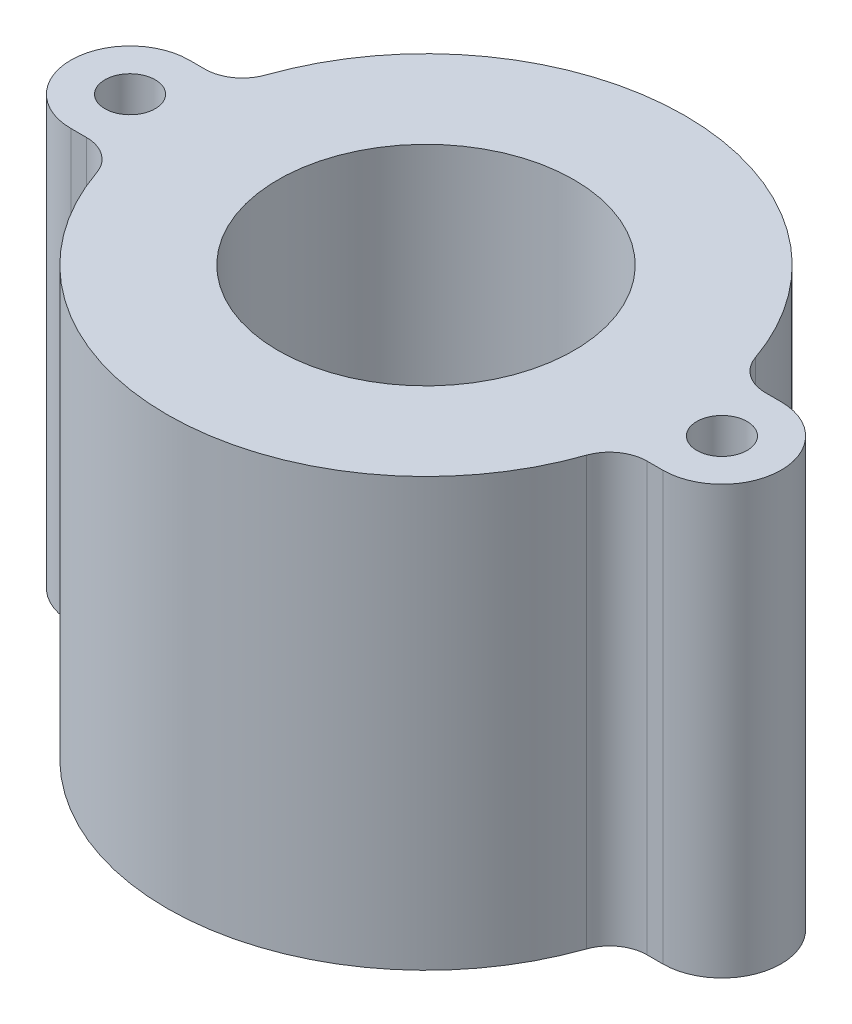
ISO-10303-21;
HEADER;
FILE_DESCRIPTION(('STEP AP214'),'2;1');
FILE_NAME('part.step','',(''),(''),'','','');
FILE_SCHEMA(('AUTOMOTIVE_DESIGN { 1 0 10303 214 1 1 1 1 }'));
ENDSEC;
DATA;
#1=APPLICATION_CONTEXT('core data for automotive mechanical design processes');
#2=APPLICATION_PROTOCOL_DEFINITION('international standard','automotive_design',2000,#1);
#3=PRODUCT_CONTEXT('',#1,'mechanical');
#4=PRODUCT('Part','Part','',(#3));
#5=PRODUCT_RELATED_PRODUCT_CATEGORY('part','',(#4));
#6=PRODUCT_DEFINITION_FORMATION('','',#4);
#7=PRODUCT_DEFINITION_CONTEXT('part definition',#1,'design');
#8=PRODUCT_DEFINITION('design','',#6,#7);
#9=PRODUCT_DEFINITION_SHAPE('','',#8);
#10=(LENGTH_UNIT() NAMED_UNIT(*) SI_UNIT(.MILLI.,.METRE.));
#11=(NAMED_UNIT(*) PLANE_ANGLE_UNIT() SI_UNIT($,.RADIAN.));
#12=(NAMED_UNIT(*) SI_UNIT($,.STERADIAN.) SOLID_ANGLE_UNIT());
#13=UNCERTAINTY_MEASURE_WITH_UNIT(LENGTH_MEASURE(1.E-05),#10,'distance_accuracy_value','');
#14=(GEOMETRIC_REPRESENTATION_CONTEXT(3) GLOBAL_UNCERTAINTY_ASSIGNED_CONTEXT((#13)) GLOBAL_UNIT_ASSIGNED_CONTEXT((#10,
#11,#12)) REPRESENTATION_CONTEXT('',''));
#15=CARTESIAN_POINT('',(0.,0.,0.));
#16=DIRECTION('',(0.,0.,1.));
#17=DIRECTION('',(1.,0.,0.));
#18=AXIS2_PLACEMENT_3D('',#15,#16,#17);
#19=CARTESIAN_POINT('',(0.,28.9,0.));
#20=DIRECTION('',(0.,-1.,0.));
#21=DIRECTION('',(0.,0.,-1.));
#22=AXIS2_PLACEMENT_3D('',#19,#20,#21);
#23=CYLINDRICAL_SURFACE('',#22,17.5);
#24=CARTESIAN_POINT('',(0.,0.,0.));
#25=DIRECTION('',(0.,1.,0.));
#26=DIRECTION('',(0.,0.,1.));
#27=AXIS2_PLACEMENT_3D('',#24,#25,#26);
#28=CIRCLE('',#27,17.5);
#29=CARTESIAN_POINT('',(-16.5418738314683,0.,5.71107784431138));
#30=VERTEX_POINT('',#29);
#31=CARTESIAN_POINT('',(16.5418738314683,0.,5.71107784431138));
#32=VERTEX_POINT('',#31);
#33=EDGE_CURVE('E184',#30,#32,#28,.T.);
#34=ORIENTED_EDGE('',*,*,#33,.T.);
#35=DIRECTION('',(0.,-1.,0.));
#36=VECTOR('',#35,1.);
#37=CARTESIAN_POINT('',(16.5418738314683,28.9,5.71107784431138));
#38=LINE('',#37,#36);
#39=CARTESIAN_POINT('',(16.5418738314683,28.9,5.71107784431138));
#40=VERTEX_POINT('',#39);
#41=EDGE_CURVE('E242',#32,#40,#38,.F.);
#42=ORIENTED_EDGE('',*,*,#41,.T.);
#43=CARTESIAN_POINT('',(0.,28.9,0.));
#44=DIRECTION('',(0.,1.,0.));
#45=DIRECTION('',(0.,0.,1.));
#46=AXIS2_PLACEMENT_3D('',#43,#44,#45);
#47=CIRCLE('',#46,17.5);
#48=CARTESIAN_POINT('',(-16.5418738314683,28.9,5.71107784431138));
#49=VERTEX_POINT('',#48);
#50=EDGE_CURVE('E154',#49,#40,#47,.T.);
#51=ORIENTED_EDGE('',*,*,#50,.F.);
#52=DIRECTION('',(0.,-1.,0.));
#53=VECTOR('',#52,1.);
#54=CARTESIAN_POINT('',(-16.5418738314683,28.9,5.71107784431138));
#55=LINE('',#54,#53);
#56=EDGE_CURVE('E238',#49,#30,#55,.T.);
#57=ORIENTED_EDGE('',*,*,#56,.T.);
#58=EDGE_LOOP('',(#34,#42,#51,#57));
#59=FACE_BOUND('',#58,.T.);
#60=ADVANCED_FACE('F41',(#59),#23,.T.);
#61=CARTESIAN_POINT('',(0.,28.9,4.));
#62=DIRECTION('',(0.,0.,1.));
#63=DIRECTION('',(1.,0.,0.));
#64=AXIS2_PLACEMENT_3D('',#61,#62,#63);
#65=PLANE('',#64);
#66=DIRECTION('',(-1.,0.,0.));
#67=VECTOR('',#66,1.);
#68=CARTESIAN_POINT('',(0.,28.9,4.));
#69=LINE('',#68,#67);
#70=CARTESIAN_POINT('',(20.,28.9,4.));
#71=VERTEX_POINT('',#70);
#72=CARTESIAN_POINT('',(18.9428086618643,28.9,4.));
#73=VERTEX_POINT('',#72);
#74=EDGE_CURVE('E133',#71,#73,#69,.T.);
#75=ORIENTED_EDGE('',*,*,#74,.T.);
#76=DIRECTION('',(0.,-1.,0.));
#77=VECTOR('',#76,1.);
#78=CARTESIAN_POINT('',(18.9428086618643,28.9,4.));
#79=LINE('',#78,#77);
#80=CARTESIAN_POINT('',(18.9428086618643,0.,4.));
#81=VERTEX_POINT('',#80);
#82=EDGE_CURVE('E235',#73,#81,#79,.T.);
#83=ORIENTED_EDGE('',*,*,#82,.T.);
#84=DIRECTION('',(-1.,0.,0.));
#85=VECTOR('',#84,1.);
#86=CARTESIAN_POINT('',(0.,0.,4.));
#87=LINE('',#86,#85);
#88=CARTESIAN_POINT('',(20.,0.,4.));
#89=VERTEX_POINT('',#88);
#90=EDGE_CURVE('E136',#89,#81,#87,.T.);
#91=ORIENTED_EDGE('',*,*,#90,.F.);
#92=DIRECTION('',(0.,-1.,0.));
#93=VECTOR('',#92,1.);
#94=CARTESIAN_POINT('',(20.,28.9,4.));
#95=LINE('',#94,#93);
#96=EDGE_CURVE('E129',#71,#89,#95,.T.);
#97=ORIENTED_EDGE('',*,*,#96,.F.);
#98=EDGE_LOOP('',(#75,#83,#91,#97));
#99=FACE_BOUND('',#98,.T.);
#100=ADVANCED_FACE('F131',(#99),#65,.T.);
#101=CARTESIAN_POINT('',(20.,28.9,0.));
#102=DIRECTION('',(0.,-1.,0.));
#103=DIRECTION('',(0.,0.,-1.));
#104=AXIS2_PLACEMENT_3D('',#101,#102,#103);
#105=CYLINDRICAL_SURFACE('',#104,4.);
#106=CARTESIAN_POINT('',(20.,0.,0.));
#107=DIRECTION('',(0.,1.,0.));
#108=DIRECTION('',(0.,0.,1.));
#109=AXIS2_PLACEMENT_3D('',#106,#107,#108);
#110=CIRCLE('',#109,4.);
#111=CARTESIAN_POINT('',(20.,0.,-4.));
#112=VERTEX_POINT('',#111);
#113=EDGE_CURVE('E191',#112,#89,#110,.F.);
#114=ORIENTED_EDGE('',*,*,#113,.F.);
#115=DIRECTION('',(0.,-1.,0.));
#116=VECTOR('',#115,1.);
#117=CARTESIAN_POINT('',(20.,28.9,-4.));
#118=LINE('',#117,#116);
#119=CARTESIAN_POINT('',(20.,28.9,-4.));
#120=VERTEX_POINT('',#119);
#121=EDGE_CURVE('E143',#120,#112,#118,.T.);
#122=ORIENTED_EDGE('',*,*,#121,.F.);
#123=CARTESIAN_POINT('',(20.,28.9,0.));
#124=DIRECTION('',(0.,1.,0.));
#125=DIRECTION('',(0.,0.,1.));
#126=AXIS2_PLACEMENT_3D('',#123,#124,#125);
#127=CIRCLE('',#126,4.);
#128=EDGE_CURVE('E149',#120,#71,#127,.F.);
#129=ORIENTED_EDGE('',*,*,#128,.T.);
#130=ORIENTED_EDGE('',*,*,#96,.T.);
#131=EDGE_LOOP('',(#114,#122,#129,#130));
#132=FACE_BOUND('',#131,.T.);
#133=ADVANCED_FACE('F156',(#132),#105,.T.);
#134=CARTESIAN_POINT('',(0.,28.9,-4.));
#135=DIRECTION('',(0.,0.,1.));
#136=DIRECTION('',(1.,0.,0.));
#137=AXIS2_PLACEMENT_3D('',#134,#135,#136);
#138=PLANE('',#137);
#139=DIRECTION('',(-1.,0.,0.));
#140=VECTOR('',#139,1.);
#141=CARTESIAN_POINT('',(0.,0.,-4.));
#142=LINE('',#141,#140);
#143=CARTESIAN_POINT('',(18.9428086618643,0.,-4.));
#144=VERTEX_POINT('',#143);
#145=EDGE_CURVE('E194',#112,#144,#142,.T.);
#146=ORIENTED_EDGE('',*,*,#145,.T.);
#147=DIRECTION('',(0.,1.,0.));
#148=VECTOR('',#147,1.);
#149=CARTESIAN_POINT('',(18.9428086618643,28.9,-4.));
#150=LINE('',#149,#148);
#151=CARTESIAN_POINT('',(18.9428086618643,28.9,-4.));
#152=VERTEX_POINT('',#151);
#153=EDGE_CURVE('E232',#144,#152,#150,.T.);
#154=ORIENTED_EDGE('',*,*,#153,.T.);
#155=DIRECTION('',(-1.,0.,0.));
#156=VECTOR('',#155,1.);
#157=CARTESIAN_POINT('',(0.,28.9,-4.));
#158=LINE('',#157,#156);
#159=EDGE_CURVE('E159',#120,#152,#158,.T.);
#160=ORIENTED_EDGE('',*,*,#159,.F.);
#161=ORIENTED_EDGE('',*,*,#121,.T.);
#162=EDGE_LOOP('',(#146,#154,#160,#161));
#163=FACE_BOUND('',#162,.T.);
#164=ADVANCED_FACE('F325',(#163),#138,.F.);
#165=CARTESIAN_POINT('',(0.,28.9,0.));
#166=DIRECTION('',(0.,-1.,0.));
#167=DIRECTION('',(0.,0.,-1.));
#168=AXIS2_PLACEMENT_3D('',#165,#166,#167);
#169=CYLINDRICAL_SURFACE('',#168,17.5);
#170=CARTESIAN_POINT('',(0.,0.,0.));
#171=DIRECTION('',(0.,1.,0.));
#172=DIRECTION('',(0.,0.,1.));
#173=AXIS2_PLACEMENT_3D('',#170,#171,#172);
#174=CIRCLE('',#173,17.5);
#175=CARTESIAN_POINT('',(16.5418738314683,0.,-5.71107784431138));
#176=VERTEX_POINT('',#175);
#177=CARTESIAN_POINT('',(-16.5418738314683,0.,-5.71107784431137));
#178=VERTEX_POINT('',#177);
#179=EDGE_CURVE('E198',#176,#178,#174,.T.);
#180=ORIENTED_EDGE('',*,*,#179,.T.);
#181=DIRECTION('',(0.,-1.,0.));
#182=VECTOR('',#181,1.);
#183=CARTESIAN_POINT('',(-16.5418738314683,28.9,-5.71107784431137));
#184=LINE('',#183,#182);
#185=CARTESIAN_POINT('',(-16.5418738314683,28.9,-5.71107784431137));
#186=VERTEX_POINT('',#185);
#187=EDGE_CURVE('E229',#178,#186,#184,.F.);
#188=ORIENTED_EDGE('',*,*,#187,.T.);
#189=CARTESIAN_POINT('',(0.,28.9,0.));
#190=DIRECTION('',(0.,1.,0.));
#191=DIRECTION('',(0.,0.,1.));
#192=AXIS2_PLACEMENT_3D('',#189,#190,#191);
#193=CIRCLE('',#192,17.5);
#194=CARTESIAN_POINT('',(16.5418738314683,28.9,-5.71107784431138));
#195=VERTEX_POINT('',#194);
#196=EDGE_CURVE('E162',#195,#186,#193,.T.);
#197=ORIENTED_EDGE('',*,*,#196,.F.);
#198=DIRECTION('',(0.,-1.,0.));
#199=VECTOR('',#198,1.);
#200=CARTESIAN_POINT('',(16.5418738314683,28.9,-5.71107784431138));
#201=LINE('',#200,#199);
#202=EDGE_CURVE('E225',#195,#176,#201,.T.);
#203=ORIENTED_EDGE('',*,*,#202,.T.);
#204=EDGE_LOOP('',(#180,#188,#197,#203));
#205=FACE_BOUND('',#204,.T.);
#206=ADVANCED_FACE('F319',(#205),#169,.T.);
#207=CARTESIAN_POINT('',(0.,28.9,-4.));
#208=DIRECTION('',(0.,0.,1.));
#209=DIRECTION('',(1.,0.,0.));
#210=AXIS2_PLACEMENT_3D('',#207,#208,#209);
#211=PLANE('',#210);
#212=DIRECTION('',(-1.,0.,0.));
#213=VECTOR('',#212,1.);
#214=CARTESIAN_POINT('',(0.,28.9,-4.));
#215=LINE('',#214,#213);
#216=CARTESIAN_POINT('',(-18.9428086618643,28.9,-4.));
#217=VERTEX_POINT('',#216);
#218=CARTESIAN_POINT('',(-20.,28.9,-4.));
#219=VERTEX_POINT('',#218);
#220=EDGE_CURVE('E169',#217,#219,#215,.T.);
#221=ORIENTED_EDGE('',*,*,#220,.F.);
#222=DIRECTION('',(0.,1.,0.));
#223=VECTOR('',#222,1.);
#224=CARTESIAN_POINT('',(-18.9428086618643,0.,-4.));
#225=LINE('',#224,#223);
#226=CARTESIAN_POINT('',(-18.9428086618643,0.,-4.));
#227=VERTEX_POINT('',#226);
#228=EDGE_CURVE('E142',#217,#227,#225,.F.);
#229=ORIENTED_EDGE('',*,*,#228,.T.);
#230=DIRECTION('',(-1.,0.,0.));
#231=VECTOR('',#230,1.);
#232=CARTESIAN_POINT('',(0.,0.,-4.));
#233=LINE('',#232,#231);
#234=CARTESIAN_POINT('',(-20.,0.,-4.));
#235=VERTEX_POINT('',#234);
#236=EDGE_CURVE('E202',#227,#235,#233,.T.);
#237=ORIENTED_EDGE('',*,*,#236,.T.);
#238=DIRECTION('',(0.,-1.,0.));
#239=VECTOR('',#238,1.);
#240=CARTESIAN_POINT('',(-20.,28.9,-4.));
#241=LINE('',#240,#239);
#242=EDGE_CURVE('E216',#219,#235,#241,.T.);
#243=ORIENTED_EDGE('',*,*,#242,.F.);
#244=EDGE_LOOP('',(#221,#229,#237,#243));
#245=FACE_BOUND('',#244,.T.);
#246=ADVANCED_FACE('F310',(#245),#211,.F.);
#247=CARTESIAN_POINT('',(-20.,28.9,0.));
#248=DIRECTION('',(0.,-1.,0.));
#249=DIRECTION('',(0.,0.,-1.));
#250=AXIS2_PLACEMENT_3D('',#247,#248,#249);
#251=CYLINDRICAL_SURFACE('',#250,4.);
#252=CARTESIAN_POINT('',(-20.,0.,0.));
#253=DIRECTION('',(0.,1.,0.));
#254=DIRECTION('',(0.,0.,1.));
#255=AXIS2_PLACEMENT_3D('',#252,#253,#254);
#256=CIRCLE('',#255,4.);
#257=CARTESIAN_POINT('',(-20.,0.,4.));
#258=VERTEX_POINT('',#257);
#259=EDGE_CURVE('E205',#235,#258,#256,.T.);
#260=ORIENTED_EDGE('',*,*,#259,.T.);
#261=DIRECTION('',(0.,-1.,0.));
#262=VECTOR('',#261,1.);
#263=CARTESIAN_POINT('',(-20.,28.9,4.));
#264=LINE('',#263,#262);
#265=CARTESIAN_POINT('',(-20.,28.9,4.));
#266=VERTEX_POINT('',#265);
#267=EDGE_CURVE('E179',#266,#258,#264,.T.);
#268=ORIENTED_EDGE('',*,*,#267,.F.);
#269=CARTESIAN_POINT('',(-20.,28.9,0.));
#270=DIRECTION('',(0.,1.,0.));
#271=DIRECTION('',(0.,0.,1.));
#272=AXIS2_PLACEMENT_3D('',#269,#270,#271);
#273=CIRCLE('',#272,4.);
#274=EDGE_CURVE('E172',#219,#266,#273,.T.);
#275=ORIENTED_EDGE('',*,*,#274,.F.);
#276=ORIENTED_EDGE('',*,*,#242,.T.);
#277=EDGE_LOOP('',(#260,#268,#275,#276));
#278=FACE_BOUND('',#277,.T.);
#279=ADVANCED_FACE('F294',(#278),#251,.T.);
#280=CARTESIAN_POINT('',(0.,28.9,0.));
#281=DIRECTION('',(0.,-1.,0.));
#282=DIRECTION('',(0.,0.,-1.));
#283=AXIS2_PLACEMENT_3D('',#280,#281,#282);
#284=CYLINDRICAL_SURFACE('',#283,10.);
#285=CARTESIAN_POINT('',(0.,28.9,0.));
#286=DIRECTION('',(0.,1.,0.));
#287=DIRECTION('',(0.,0.,1.));
#288=AXIS2_PLACEMENT_3D('',#285,#286,#287);
#289=CIRCLE('',#288,10.);
#290=CARTESIAN_POINT('',(0.,28.9,10.));
#291=VERTEX_POINT('',#290);
#292=EDGE_CURVE('E212',#291,#291,#289,.T.);
#293=ORIENTED_EDGE('',*,*,#292,.T.);
#294=EDGE_LOOP('',(#293));
#295=FACE_BOUND('',#294,.T.);
#296=CARTESIAN_POINT('',(0.,0.,0.));
#297=DIRECTION('',(0.,1.,0.));
#298=DIRECTION('',(0.,0.,1.));
#299=AXIS2_PLACEMENT_3D('',#296,#297,#298);
#300=CIRCLE('',#299,10.);
#301=CARTESIAN_POINT('',(0.,0.,10.));
#302=VERTEX_POINT('',#301);
#303=EDGE_CURVE('E180',#302,#302,#300,.T.);
#304=ORIENTED_EDGE('',*,*,#303,.F.);
#305=EDGE_LOOP('',(#304));
#306=FACE_BOUND('',#305,.T.);
#307=ADVANCED_FACE('F290',(#295,#306),#284,.F.);
#308=CARTESIAN_POINT('',(0.,28.9,4.));
#309=DIRECTION('',(0.,0.,1.));
#310=DIRECTION('',(1.,0.,0.));
#311=AXIS2_PLACEMENT_3D('',#308,#309,#310);
#312=PLANE('',#311);
#313=DIRECTION('',(-1.,0.,0.));
#314=VECTOR('',#313,1.);
#315=CARTESIAN_POINT('',(0.,0.,4.));
#316=LINE('',#315,#314);
#317=CARTESIAN_POINT('',(-18.9428086618643,0.,4.));
#318=VERTEX_POINT('',#317);
#319=EDGE_CURVE('E209',#318,#258,#316,.T.);
#320=ORIENTED_EDGE('',*,*,#319,.F.);
#321=DIRECTION('',(0.,-1.,0.));
#322=VECTOR('',#321,1.);
#323=CARTESIAN_POINT('',(-18.9428086618643,28.9,4.));
#324=LINE('',#323,#322);
#325=CARTESIAN_POINT('',(-18.9428086618643,28.9,4.));
#326=VERTEX_POINT('',#325);
#327=EDGE_CURVE('E57',#318,#326,#324,.F.);
#328=ORIENTED_EDGE('',*,*,#327,.T.);
#329=DIRECTION('',(-1.,0.,0.));
#330=VECTOR('',#329,1.);
#331=CARTESIAN_POINT('',(0.,28.9,4.));
#332=LINE('',#331,#330);
#333=EDGE_CURVE('E176',#326,#266,#332,.T.);
#334=ORIENTED_EDGE('',*,*,#333,.T.);
#335=ORIENTED_EDGE('',*,*,#267,.T.);
#336=EDGE_LOOP('',(#320,#328,#334,#335));
#337=FACE_BOUND('',#336,.T.);
#338=ADVANCED_FACE('F293',(#337),#312,.T.);
#339=CARTESIAN_POINT('',(0.,28.9,0.));
#340=DIRECTION('',(0.,1.,0.));
#341=DIRECTION('',(0.,0.,1.));
#342=AXIS2_PLACEMENT_3D('',#339,#340,#341);
#343=PLANE('',#342);
#344=CARTESIAN_POINT('',(-20.,28.9,0.));
#345=DIRECTION('',(0.,1.,0.));
#346=DIRECTION('',(0.,0.,1.));
#347=AXIS2_PLACEMENT_3D('',#344,#345,#346);
#348=CIRCLE('',#347,1.69999999999999);
#349=CARTESIAN_POINT('',(-20.,28.9,1.69999999999999));
#350=VERTEX_POINT('',#349);
#351=EDGE_CURVE('E357',#350,#350,#348,.T.);
#352=ORIENTED_EDGE('',*,*,#351,.F.);
#353=EDGE_LOOP('',(#352));
#354=FACE_BOUND('',#353,.T.);
#355=CARTESIAN_POINT('',(20.,28.9,0.));
#356=DIRECTION('',(0.,1.,0.));
#357=DIRECTION('',(0.,0.,1.));
#358=AXIS2_PLACEMENT_3D('',#355,#356,#357);
#359=CIRCLE('',#358,1.69999999999999);
#360=CARTESIAN_POINT('',(20.,28.9,1.69999999999999));
#361=VERTEX_POINT('',#360);
#362=EDGE_CURVE('E361',#361,#361,#359,.T.);
#363=ORIENTED_EDGE('',*,*,#362,.F.);
#364=EDGE_LOOP('',(#363));
#365=FACE_BOUND('',#364,.T.);
#366=ORIENTED_EDGE('',*,*,#292,.F.);
#367=EDGE_LOOP('',(#366));
#368=FACE_BOUND('',#367,.T.);
#369=ORIENTED_EDGE('',*,*,#333,.F.);
#370=CARTESIAN_POINT('',(-18.9428086618643,28.9,6.54));
#371=DIRECTION('',(0.,1.,0.));
#372=DIRECTION('',(0.,0.,1.));
#373=AXIS2_PLACEMENT_3D('',#370,#371,#372);
#374=CIRCLE('',#373,2.54);
#375=EDGE_CURVE('E11',#326,#49,#374,.F.);
#376=ORIENTED_EDGE('',*,*,#375,.T.);
#377=ORIENTED_EDGE('',*,*,#50,.T.);
#378=CARTESIAN_POINT('',(18.9428086618643,28.9,6.54));
#379=DIRECTION('',(0.,1.,0.));
#380=DIRECTION('',(0.,0.,1.));
#381=AXIS2_PLACEMENT_3D('',#378,#379,#380);
#382=CIRCLE('',#381,2.54);
#383=EDGE_CURVE('E152',#40,#73,#382,.F.);
#384=ORIENTED_EDGE('',*,*,#383,.T.);
#385=ORIENTED_EDGE('',*,*,#74,.F.);
#386=ORIENTED_EDGE('',*,*,#128,.F.);
#387=ORIENTED_EDGE('',*,*,#159,.T.);
#388=CARTESIAN_POINT('',(18.9428086618643,28.9,-6.54));
#389=DIRECTION('',(0.,1.,0.));
#390=DIRECTION('',(0.,0.,1.));
#391=AXIS2_PLACEMENT_3D('',#388,#389,#390);
#392=CIRCLE('',#391,2.54);
#393=EDGE_CURVE('E256',#152,#195,#392,.F.);
#394=ORIENTED_EDGE('',*,*,#393,.T.);
#395=ORIENTED_EDGE('',*,*,#196,.T.);
#396=CARTESIAN_POINT('',(-18.9428086618643,28.9,-6.54));
#397=DIRECTION('',(0.,1.,0.));
#398=DIRECTION('',(0.,0.,1.));
#399=AXIS2_PLACEMENT_3D('',#396,#397,#398);
#400=CIRCLE('',#399,2.54);
#401=EDGE_CURVE('E250',#186,#217,#400,.F.);
#402=ORIENTED_EDGE('',*,*,#401,.T.);
#403=ORIENTED_EDGE('',*,*,#220,.T.);
#404=ORIENTED_EDGE('',*,*,#274,.T.);
#405=EDGE_LOOP('',(#369,#376,#377,#384,#385,#386,#387,#394,#395,#402,#403,#404));
#406=FACE_BOUND('',#405,.T.);
#407=ADVANCED_FACE('F147',(#354,#365,#368,#406),#343,.T.);
#408=CARTESIAN_POINT('',(0.,0.,0.));
#409=DIRECTION('',(0.,1.,0.));
#410=DIRECTION('',(0.,0.,1.));
#411=AXIS2_PLACEMENT_3D('',#408,#409,#410);
#412=PLANE('',#411);
#413=CARTESIAN_POINT('',(-20.,0.,0.));
#414=DIRECTION('',(0.,1.,0.));
#415=DIRECTION('',(0.,0.,1.));
#416=AXIS2_PLACEMENT_3D('',#413,#414,#415);
#417=CIRCLE('',#416,1.7);
#418=CARTESIAN_POINT('',(-20.,0.,1.7));
#419=VERTEX_POINT('',#418);
#420=EDGE_CURVE('E354',#419,#419,#417,.T.);
#421=ORIENTED_EDGE('',*,*,#420,.T.);
#422=EDGE_LOOP('',(#421));
#423=FACE_BOUND('',#422,.T.);
#424=CARTESIAN_POINT('',(20.,0.,0.));
#425=DIRECTION('',(0.,1.,0.));
#426=DIRECTION('',(0.,0.,1.));
#427=AXIS2_PLACEMENT_3D('',#424,#425,#426);
#428=CIRCLE('',#427,1.7);
#429=CARTESIAN_POINT('',(20.,0.,1.7));
#430=VERTEX_POINT('',#429);
#431=EDGE_CURVE('E185',#430,#430,#428,.T.);
#432=ORIENTED_EDGE('',*,*,#431,.T.);
#433=EDGE_LOOP('',(#432));
#434=FACE_BOUND('',#433,.T.);
#435=ORIENTED_EDGE('',*,*,#303,.T.);
#436=EDGE_LOOP('',(#435));
#437=FACE_BOUND('',#436,.T.);
#438=ORIENTED_EDGE('',*,*,#33,.F.);
#439=CARTESIAN_POINT('',(-18.9428086618643,0.,6.54));
#440=DIRECTION('',(0.,1.,0.));
#441=DIRECTION('',(0.,0.,1.));
#442=AXIS2_PLACEMENT_3D('',#439,#440,#441);
#443=CIRCLE('',#442,2.54);
#444=EDGE_CURVE('E50',#30,#318,#443,.T.);
#445=ORIENTED_EDGE('',*,*,#444,.T.);
#446=ORIENTED_EDGE('',*,*,#319,.T.);
#447=ORIENTED_EDGE('',*,*,#259,.F.);
#448=ORIENTED_EDGE('',*,*,#236,.F.);
#449=CARTESIAN_POINT('',(-18.9428086618643,0.,-6.54));
#450=DIRECTION('',(0.,1.,0.));
#451=DIRECTION('',(0.,0.,1.));
#452=AXIS2_PLACEMENT_3D('',#449,#450,#451);
#453=CIRCLE('',#452,2.54);
#454=EDGE_CURVE('E247',#227,#178,#453,.T.);
#455=ORIENTED_EDGE('',*,*,#454,.T.);
#456=ORIENTED_EDGE('',*,*,#179,.F.);
#457=CARTESIAN_POINT('',(18.9428086618643,0.,-6.54));
#458=DIRECTION('',(0.,1.,0.));
#459=DIRECTION('',(0.,0.,1.));
#460=AXIS2_PLACEMENT_3D('',#457,#458,#459);
#461=CIRCLE('',#460,2.54);
#462=EDGE_CURVE('E253',#176,#144,#461,.T.);
#463=ORIENTED_EDGE('',*,*,#462,.T.);
#464=ORIENTED_EDGE('',*,*,#145,.F.);
#465=ORIENTED_EDGE('',*,*,#113,.T.);
#466=ORIENTED_EDGE('',*,*,#90,.T.);
#467=CARTESIAN_POINT('',(18.9428086618643,0.,6.54));
#468=DIRECTION('',(0.,1.,0.));
#469=DIRECTION('',(0.,0.,1.));
#470=AXIS2_PLACEMENT_3D('',#467,#468,#469);
#471=CIRCLE('',#470,2.54);
#472=EDGE_CURVE('E259',#81,#32,#471,.T.);
#473=ORIENTED_EDGE('',*,*,#472,.T.);
#474=EDGE_LOOP('',(#438,#445,#446,#447,#448,#455,#456,#463,#464,#465,#466,#473));
#475=FACE_BOUND('',#474,.T.);
#476=ADVANCED_FACE('F264',(#423,#434,#437,#475),#412,.F.);
#477=CARTESIAN_POINT('',(-18.9428086618643,28.9,-6.54));
#478=DIRECTION('',(0.,-1.,0.));
#479=DIRECTION('',(0.,0.,-1.));
#480=AXIS2_PLACEMENT_3D('',#477,#478,#479);
#481=CYLINDRICAL_SURFACE('',#480,2.54);
#482=ORIENTED_EDGE('',*,*,#401,.F.);
#483=ORIENTED_EDGE('',*,*,#187,.F.);
#484=ORIENTED_EDGE('',*,*,#454,.F.);
#485=ORIENTED_EDGE('',*,*,#228,.F.);
#486=EDGE_LOOP('',(#482,#483,#484,#485));
#487=FACE_BOUND('',#486,.T.);
#488=ADVANCED_FACE('F279',(#487),#481,.F.);
#489=CARTESIAN_POINT('',(18.9428086618643,28.9,-6.54));
#490=DIRECTION('',(0.,-1.,0.));
#491=DIRECTION('',(0.,0.,-1.));
#492=AXIS2_PLACEMENT_3D('',#489,#490,#491);
#493=CYLINDRICAL_SURFACE('',#492,2.54);
#494=ORIENTED_EDGE('',*,*,#393,.F.);
#495=ORIENTED_EDGE('',*,*,#153,.F.);
#496=ORIENTED_EDGE('',*,*,#462,.F.);
#497=ORIENTED_EDGE('',*,*,#202,.F.);
#498=EDGE_LOOP('',(#494,#495,#496,#497));
#499=FACE_BOUND('',#498,.T.);
#500=ADVANCED_FACE('F272',(#499),#493,.F.);
#501=CARTESIAN_POINT('',(18.9428086618643,28.9,6.54));
#502=DIRECTION('',(0.,-1.,0.));
#503=DIRECTION('',(0.,0.,-1.));
#504=AXIS2_PLACEMENT_3D('',#501,#502,#503);
#505=CYLINDRICAL_SURFACE('',#504,2.54);
#506=ORIENTED_EDGE('',*,*,#383,.F.);
#507=ORIENTED_EDGE('',*,*,#41,.F.);
#508=ORIENTED_EDGE('',*,*,#472,.F.);
#509=ORIENTED_EDGE('',*,*,#82,.F.);
#510=EDGE_LOOP('',(#506,#507,#508,#509));
#511=FACE_BOUND('',#510,.T.);
#512=ADVANCED_FACE('F270',(#511),#505,.F.);
#513=CARTESIAN_POINT('',(-18.9428086618643,28.9,6.54));
#514=DIRECTION('',(0.,-1.,0.));
#515=DIRECTION('',(0.,0.,-1.));
#516=AXIS2_PLACEMENT_3D('',#513,#514,#515);
#517=CYLINDRICAL_SURFACE('',#516,2.54);
#518=ORIENTED_EDGE('',*,*,#375,.F.);
#519=ORIENTED_EDGE('',*,*,#327,.F.);
#520=ORIENTED_EDGE('',*,*,#444,.F.);
#521=ORIENTED_EDGE('',*,*,#56,.F.);
#522=EDGE_LOOP('',(#518,#519,#520,#521));
#523=FACE_BOUND('',#522,.T.);
#524=ADVANCED_FACE('F43',(#523),#517,.F.);
#525=CARTESIAN_POINT('',(20.,28.9,0.));
#526=DIRECTION('',(0.,1.,0.));
#527=DIRECTION('',(0.,0.,1.));
#528=AXIS2_PLACEMENT_3D('',#525,#526,#527);
#529=CYLINDRICAL_SURFACE('',#528,1.69999999999999);
#530=ORIENTED_EDGE('',*,*,#431,.F.);
#531=EDGE_LOOP('',(#530));
#532=FACE_BOUND('',#531,.T.);
#533=ORIENTED_EDGE('',*,*,#362,.T.);
#534=EDGE_LOOP('',(#533));
#535=FACE_BOUND('',#534,.T.);
#536=ADVANCED_FACE('F277',(#532,#535),#529,.F.);
#537=CARTESIAN_POINT('',(-20.,28.9,0.));
#538=DIRECTION('',(0.,1.,0.));
#539=DIRECTION('',(0.,0.,1.));
#540=AXIS2_PLACEMENT_3D('',#537,#538,#539);
#541=CYLINDRICAL_SURFACE('',#540,1.69999999999999);
#542=ORIENTED_EDGE('',*,*,#420,.F.);
#543=EDGE_LOOP('',(#542));
#544=FACE_BOUND('',#543,.T.);
#545=ORIENTED_EDGE('',*,*,#351,.T.);
#546=EDGE_LOOP('',(#545));
#547=FACE_BOUND('',#546,.T.);
#548=ADVANCED_FACE('F345',(#544,#547),#541,.F.);
#549=CLOSED_SHELL('',(#60,#100,#133,#164,#206,#246,#279,#307,#338,#407,#476,#488,#500,#512,#524,
#536,#548));
#550=MANIFOLD_SOLID_BREP('B2',#549);
#551=ADVANCED_BREP_SHAPE_REPRESENTATION('',(#18,#550),#14);
#552=SHAPE_DEFINITION_REPRESENTATION(#9,#551);
ENDSEC;
END-ISO-10303-21;
